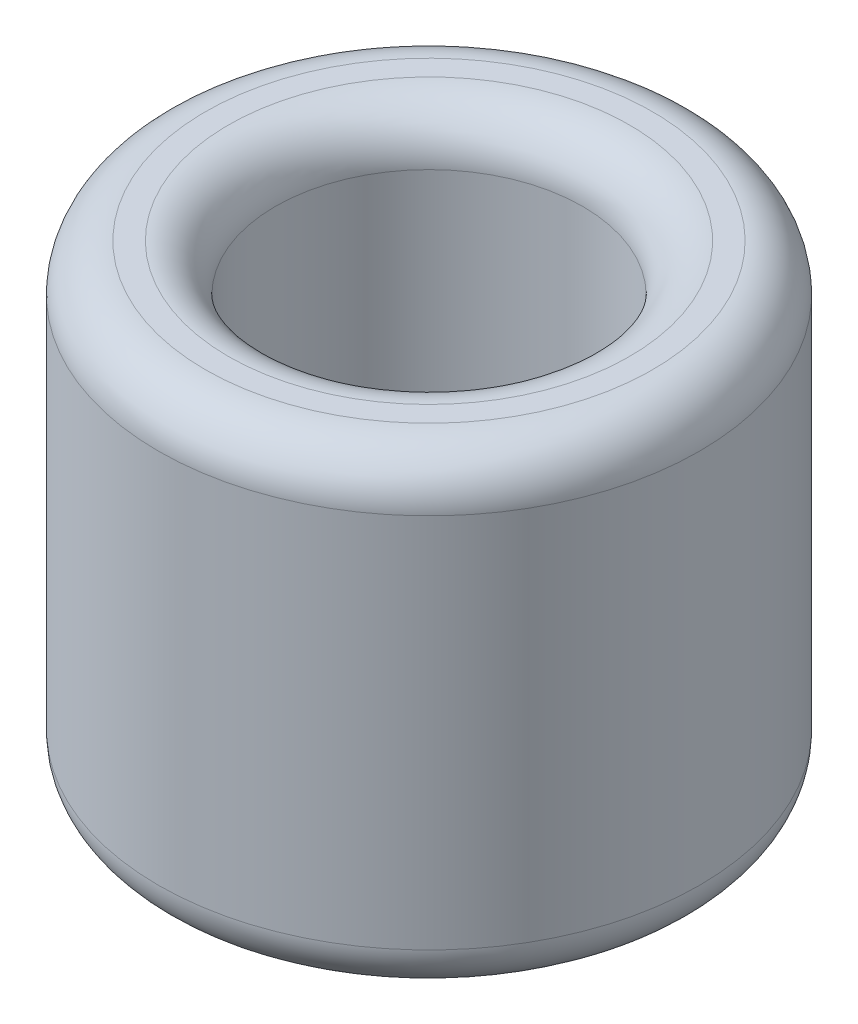
ISO-10303-21;
HEADER;
FILE_DESCRIPTION(('STEP AP214'),'2;1');
FILE_NAME('part.step','',(''),(''),'','','');
FILE_SCHEMA(('AUTOMOTIVE_DESIGN { 1 0 10303 214 1 1 1 1 }'));
ENDSEC;
DATA;
#1=APPLICATION_CONTEXT('core data for automotive mechanical design processes');
#2=APPLICATION_PROTOCOL_DEFINITION('international standard','automotive_design',2000,#1);
#3=PRODUCT_CONTEXT('',#1,'mechanical');
#4=PRODUCT('Part','Part','',(#3));
#5=PRODUCT_RELATED_PRODUCT_CATEGORY('part','',(#4));
#6=PRODUCT_DEFINITION_FORMATION('','',#4);
#7=PRODUCT_DEFINITION_CONTEXT('part definition',#1,'design');
#8=PRODUCT_DEFINITION('design','',#6,#7);
#9=PRODUCT_DEFINITION_SHAPE('','',#8);
#10=(LENGTH_UNIT() NAMED_UNIT(*) SI_UNIT(.MILLI.,.METRE.));
#11=(NAMED_UNIT(*) PLANE_ANGLE_UNIT() SI_UNIT($,.RADIAN.));
#12=(NAMED_UNIT(*) SI_UNIT($,.STERADIAN.) SOLID_ANGLE_UNIT());
#13=UNCERTAINTY_MEASURE_WITH_UNIT(LENGTH_MEASURE(1.E-05),#10,'distance_accuracy_value','');
#14=(GEOMETRIC_REPRESENTATION_CONTEXT(3) GLOBAL_UNCERTAINTY_ASSIGNED_CONTEXT((#13)) GLOBAL_UNIT_ASSIGNED_CONTEXT((#10,
#11,#12)) REPRESENTATION_CONTEXT('',''));
#15=CARTESIAN_POINT('',(0.,0.,0.));
#16=DIRECTION('',(0.,0.,1.));
#17=DIRECTION('',(1.,0.,0.));
#18=AXIS2_PLACEMENT_3D('',#15,#16,#17);
#19=CARTESIAN_POINT('',(0.,25.4,0.));
#20=DIRECTION('',(0.,-1.,0.));
#21=DIRECTION('',(0.,0.,-1.));
#22=AXIS2_PLACEMENT_3D('',#19,#20,#21);
#23=CYLINDRICAL_SURFACE('',#22,14.6221163715808);
#24=CARTESIAN_POINT('',(0.,2.54,0.));
#25=DIRECTION('',(0.,1.,0.));
#26=DIRECTION('',(0.,0.,1.));
#27=AXIS2_PLACEMENT_3D('',#24,#25,#26);
#28=CIRCLE('',#27,14.6221163715808);
#29=CARTESIAN_POINT('',(0.,2.54,14.6221163715808));
#30=VERTEX_POINT('',#29);
#31=EDGE_CURVE('E10',#30,#30,#28,.T.);
#32=ORIENTED_EDGE('',*,*,#31,.T.);
#33=EDGE_LOOP('',(#32));
#34=FACE_BOUND('',#33,.T.);
#35=CARTESIAN_POINT('',(0.,22.86,0.));
#36=DIRECTION('',(0.,1.,0.));
#37=DIRECTION('',(0.,0.,1.));
#38=AXIS2_PLACEMENT_3D('',#35,#36,#37);
#39=CIRCLE('',#38,14.6221163715808);
#40=CARTESIAN_POINT('',(0.,22.86,14.6221163715808));
#41=VERTEX_POINT('',#40);
#42=EDGE_CURVE('E38',#41,#41,#39,.F.);
#43=ORIENTED_EDGE('',*,*,#42,.T.);
#44=EDGE_LOOP('',(#43));
#45=FACE_BOUND('',#44,.T.);
#46=ADVANCED_FACE('F31',(#34,#45),#23,.T.);
#47=CARTESIAN_POINT('',(0.,25.4,0.));
#48=DIRECTION('',(0.,1.,0.));
#49=DIRECTION('',(0.,0.,1.));
#50=AXIS2_PLACEMENT_3D('',#47,#48,#49);
#51=PLANE('',#50);
#52=CARTESIAN_POINT('',(0.,25.4,0.));
#53=DIRECTION('',(0.,1.,0.));
#54=DIRECTION('',(0.,0.,1.));
#55=AXIS2_PLACEMENT_3D('',#52,#53,#54);
#56=CIRCLE('',#55,10.84);
#57=CARTESIAN_POINT('',(0.,25.4,10.84));
#58=VERTEX_POINT('',#57);
#59=EDGE_CURVE('E42',#58,#58,#56,.F.);
#60=ORIENTED_EDGE('',*,*,#59,.T.);
#61=EDGE_LOOP('',(#60));
#62=FACE_BOUND('',#61,.T.);
#63=CARTESIAN_POINT('',(0.,25.4,0.));
#64=DIRECTION('',(0.,1.,0.));
#65=DIRECTION('',(0.,0.,1.));
#66=AXIS2_PLACEMENT_3D('',#63,#64,#65);
#67=CIRCLE('',#66,12.0821163715808);
#68=CARTESIAN_POINT('',(0.,25.4,12.0821163715808));
#69=VERTEX_POINT('',#68);
#70=EDGE_CURVE('E46',#69,#69,#67,.T.);
#71=ORIENTED_EDGE('',*,*,#70,.T.);
#72=EDGE_LOOP('',(#71));
#73=FACE_BOUND('',#72,.T.);
#74=ADVANCED_FACE('F79',(#62,#73),#51,.T.);
#75=CARTESIAN_POINT('',(0.,0.,0.));
#76=DIRECTION('',(0.,1.,0.));
#77=DIRECTION('',(0.,0.,1.));
#78=AXIS2_PLACEMENT_3D('',#75,#76,#77);
#79=PLANE('',#78);
#80=CARTESIAN_POINT('',(0.,0.,0.));
#81=DIRECTION('',(0.,1.,0.));
#82=DIRECTION('',(0.,0.,1.));
#83=AXIS2_PLACEMENT_3D('',#80,#81,#82);
#84=CIRCLE('',#83,10.84);
#85=CARTESIAN_POINT('',(0.,0.,10.84));
#86=VERTEX_POINT('',#85);
#87=EDGE_CURVE('E57',#86,#86,#84,.T.);
#88=ORIENTED_EDGE('',*,*,#87,.T.);
#89=EDGE_LOOP('',(#88));
#90=FACE_BOUND('',#89,.T.);
#91=CARTESIAN_POINT('',(0.,0.,0.));
#92=DIRECTION('',(0.,1.,0.));
#93=DIRECTION('',(0.,0.,1.));
#94=AXIS2_PLACEMENT_3D('',#91,#92,#93);
#95=CIRCLE('',#94,12.0821163715808);
#96=CARTESIAN_POINT('',(0.,0.,12.0821163715808));
#97=VERTEX_POINT('',#96);
#98=EDGE_CURVE('E60',#97,#97,#95,.F.);
#99=ORIENTED_EDGE('',*,*,#98,.T.);
#100=EDGE_LOOP('',(#99));
#101=FACE_BOUND('',#100,.T.);
#102=ADVANCED_FACE('F64',(#90,#101),#79,.F.);
#103=CARTESIAN_POINT('',(0.,0.,0.));
#104=DIRECTION('',(0.,1.,0.));
#105=DIRECTION('',(0.,0.,1.));
#106=AXIS2_PLACEMENT_3D('',#103,#104,#105);
#107=CYLINDRICAL_SURFACE('',#106,8.3);
#108=CARTESIAN_POINT('',(0.,2.54,0.));
#109=DIRECTION('',(0.,1.,0.));
#110=DIRECTION('',(0.,0.,1.));
#111=AXIS2_PLACEMENT_3D('',#108,#109,#110);
#112=CIRCLE('',#111,8.3);
#113=CARTESIAN_POINT('',(0.,2.54,8.3));
#114=VERTEX_POINT('',#113);
#115=EDGE_CURVE('E51',#114,#114,#112,.F.);
#116=ORIENTED_EDGE('',*,*,#115,.T.);
#117=EDGE_LOOP('',(#116));
#118=FACE_BOUND('',#117,.T.);
#119=CARTESIAN_POINT('',(0.,22.86,0.));
#120=DIRECTION('',(0.,1.,0.));
#121=DIRECTION('',(0.,0.,1.));
#122=AXIS2_PLACEMENT_3D('',#119,#120,#121);
#123=CIRCLE('',#122,8.3);
#124=CARTESIAN_POINT('',(0.,22.86,8.3));
#125=VERTEX_POINT('',#124);
#126=EDGE_CURVE('E54',#125,#125,#123,.T.);
#127=ORIENTED_EDGE('',*,*,#126,.T.);
#128=EDGE_LOOP('',(#127));
#129=FACE_BOUND('',#128,.T.);
#130=ADVANCED_FACE('F89',(#118,#129),#107,.F.);
#131=CARTESIAN_POINT('',(0.,2.54,0.));
#132=DIRECTION('',(0.,1.,0.));
#133=DIRECTION('',(0.,0.,1.));
#134=AXIS2_PLACEMENT_3D('',#131,#132,#133);
#135=TOROIDAL_SURFACE('',#134,10.84,2.54);
#136=ORIENTED_EDGE('',*,*,#115,.F.);
#137=EDGE_LOOP('',(#136));
#138=FACE_BOUND('',#137,.T.);
#139=ORIENTED_EDGE('',*,*,#87,.F.);
#140=EDGE_LOOP('',(#139));
#141=FACE_BOUND('',#140,.T.);
#142=ADVANCED_FACE('F75',(#138,#141),#135,.T.);
#143=CARTESIAN_POINT('',(0.,22.86,0.));
#144=DIRECTION('',(0.,1.,0.));
#145=DIRECTION('',(0.,0.,1.));
#146=AXIS2_PLACEMENT_3D('',#143,#144,#145);
#147=TOROIDAL_SURFACE('',#146,10.84,2.54);
#148=ORIENTED_EDGE('',*,*,#59,.F.);
#149=EDGE_LOOP('',(#148));
#150=FACE_BOUND('',#149,.T.);
#151=ORIENTED_EDGE('',*,*,#126,.F.);
#152=EDGE_LOOP('',(#151));
#153=FACE_BOUND('',#152,.T.);
#154=ADVANCED_FACE('F69',(#150,#153),#147,.T.);
#155=CARTESIAN_POINT('',(0.,2.54,0.));
#156=DIRECTION('',(0.,1.,0.));
#157=DIRECTION('',(0.,0.,1.));
#158=AXIS2_PLACEMENT_3D('',#155,#156,#157);
#159=TOROIDAL_SURFACE('',#158,12.0821163715808,2.54);
#160=ORIENTED_EDGE('',*,*,#98,.F.);
#161=EDGE_LOOP('',(#160));
#162=FACE_BOUND('',#161,.T.);
#163=ORIENTED_EDGE('',*,*,#31,.F.);
#164=EDGE_LOOP('',(#163));
#165=FACE_BOUND('',#164,.T.);
#166=ADVANCED_FACE('F66',(#162,#165),#159,.T.);
#167=CARTESIAN_POINT('',(0.,22.86,0.));
#168=DIRECTION('',(0.,1.,0.));
#169=DIRECTION('',(0.,0.,1.));
#170=AXIS2_PLACEMENT_3D('',#167,#168,#169);
#171=TOROIDAL_SURFACE('',#170,12.0821163715808,2.54);
#172=ORIENTED_EDGE('',*,*,#42,.F.);
#173=EDGE_LOOP('',(#172));
#174=FACE_BOUND('',#173,.T.);
#175=ORIENTED_EDGE('',*,*,#70,.F.);
#176=EDGE_LOOP('',(#175));
#177=FACE_BOUND('',#176,.T.);
#178=ADVANCED_FACE('F33',(#174,#177),#171,.T.);
#179=CLOSED_SHELL('',(#46,#74,#102,#130,#142,#154,#166,#178));
#180=MANIFOLD_SOLID_BREP('B2',#179);
#181=ADVANCED_BREP_SHAPE_REPRESENTATION('',(#18,#180),#14);
#182=SHAPE_DEFINITION_REPRESENTATION(#9,#181);
ENDSEC;
END-ISO-10303-21;
